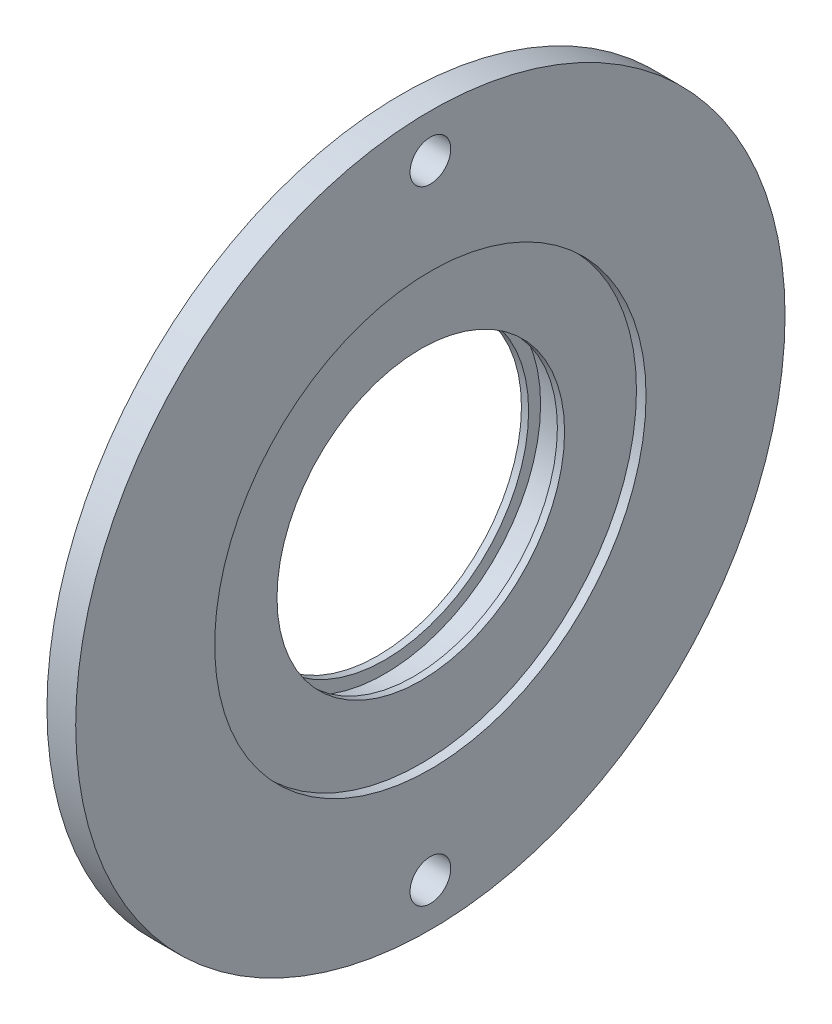
ISO-10303-21;
HEADER;
FILE_DESCRIPTION(('STEP AP214'),'2;1');
FILE_NAME('part.step','',(''),(''),'','','');
FILE_SCHEMA(('AUTOMOTIVE_DESIGN { 1 0 10303 214 1 1 1 1 }'));
ENDSEC;
DATA;
#1=APPLICATION_CONTEXT('core data for automotive mechanical design processes');
#2=APPLICATION_PROTOCOL_DEFINITION('international standard','automotive_design',2000,#1);
#3=PRODUCT_CONTEXT('',#1,'mechanical');
#4=PRODUCT('Part','Part','',(#3));
#5=PRODUCT_RELATED_PRODUCT_CATEGORY('part','',(#4));
#6=PRODUCT_DEFINITION_FORMATION('','',#4);
#7=PRODUCT_DEFINITION_CONTEXT('part definition',#1,'design');
#8=PRODUCT_DEFINITION('design','',#6,#7);
#9=PRODUCT_DEFINITION_SHAPE('','',#8);
#10=(LENGTH_UNIT() NAMED_UNIT(*) SI_UNIT(.MILLI.,.METRE.));
#11=(NAMED_UNIT(*) PLANE_ANGLE_UNIT() SI_UNIT($,.RADIAN.));
#12=(NAMED_UNIT(*) SI_UNIT($,.STERADIAN.) SOLID_ANGLE_UNIT());
#13=UNCERTAINTY_MEASURE_WITH_UNIT(LENGTH_MEASURE(1.E-05),#10,'distance_accuracy_value','');
#14=(GEOMETRIC_REPRESENTATION_CONTEXT(3) GLOBAL_UNCERTAINTY_ASSIGNED_CONTEXT((#13)) GLOBAL_UNIT_ASSIGNED_CONTEXT((#10,
#11,#12)) REPRESENTATION_CONTEXT('',''));
#15=CARTESIAN_POINT('',(0.,0.,0.));
#16=DIRECTION('',(0.,0.,1.));
#17=DIRECTION('',(1.,0.,0.));
#18=AXIS2_PLACEMENT_3D('',#15,#16,#17);
#19=CARTESIAN_POINT('',(22.,148.,0.));
#20=DIRECTION('',(1.,0.,0.));
#21=DIRECTION('',(0.,0.,-1.));
#22=AXIS2_PLACEMENT_3D('',#19,#20,#21);
#23=PLANE('',#22);
#24=CARTESIAN_POINT('',(22.,0.,0.));
#25=DIRECTION('',(1.,0.,0.));
#26=DIRECTION('',(0.,0.,-1.));
#27=AXIS2_PLACEMENT_3D('',#24,#25,#26);
#28=CIRCLE('',#27,90.);
#29=CARTESIAN_POINT('',(22.,0.,-90.));
#30=VERTEX_POINT('',#29);
#31=EDGE_CURVE('E76',#30,#30,#28,.T.);
#32=ORIENTED_EDGE('',*,*,#31,.F.);
#33=EDGE_LOOP('',(#32));
#34=FACE_BOUND('',#33,.T.);
#35=CARTESIAN_POINT('',(22.,-130.,0.));
#36=DIRECTION('',(1.,0.,0.));
#37=DIRECTION('',(0.,0.,-1.));
#38=AXIS2_PLACEMENT_3D('',#35,#36,#37);
#39=CIRCLE('',#38,8.5);
#40=CARTESIAN_POINT('',(22.,-130.,-8.5));
#41=VERTEX_POINT('',#40);
#42=EDGE_CURVE('E58',#41,#41,#39,.F.);
#43=ORIENTED_EDGE('',*,*,#42,.T.);
#44=EDGE_LOOP('',(#43));
#45=FACE_BOUND('',#44,.T.);
#46=CARTESIAN_POINT('',(22.,0.,0.));
#47=DIRECTION('',(1.,0.,0.));
#48=DIRECTION('',(0.,0.,-1.));
#49=AXIS2_PLACEMENT_3D('',#46,#47,#48);
#50=CIRCLE('',#49,148.);
#51=CARTESIAN_POINT('',(22.,0.,-148.));
#52=VERTEX_POINT('',#51);
#53=EDGE_CURVE('E69',#52,#52,#50,.T.);
#54=ORIENTED_EDGE('',*,*,#53,.T.);
#55=EDGE_LOOP('',(#54));
#56=FACE_BOUND('',#55,.T.);
#57=CARTESIAN_POINT('',(22.,130.,0.));
#58=DIRECTION('',(1.,0.,0.));
#59=DIRECTION('',(0.,0.,-1.));
#60=AXIS2_PLACEMENT_3D('',#57,#58,#59);
#61=CIRCLE('',#60,8.5);
#62=CARTESIAN_POINT('',(22.,130.,-8.5));
#63=VERTEX_POINT('',#62);
#64=EDGE_CURVE('E63',#63,#63,#61,.T.);
#65=ORIENTED_EDGE('',*,*,#64,.F.);
#66=EDGE_LOOP('',(#65));
#67=FACE_BOUND('',#66,.T.);
#68=ADVANCED_FACE('F37',(#34,#45,#56,#67),#23,.T.);
#69=CARTESIAN_POINT('',(10.,100.,0.));
#70=DIRECTION('',(-1.,0.,0.));
#71=DIRECTION('',(0.,0.,1.));
#72=AXIS2_PLACEMENT_3D('',#69,#70,#71);
#73=PLANE('',#72);
#74=CARTESIAN_POINT('',(10.,-130.,0.));
#75=DIRECTION('',(-1.,0.,0.));
#76=DIRECTION('',(0.,0.,1.));
#77=AXIS2_PLACEMENT_3D('',#74,#75,#76);
#78=CIRCLE('',#77,8.5);
#79=CARTESIAN_POINT('',(10.,-130.,8.5));
#80=VERTEX_POINT('',#79);
#81=EDGE_CURVE('E55',#80,#80,#78,.F.);
#82=ORIENTED_EDGE('',*,*,#81,.T.);
#83=EDGE_LOOP('',(#82));
#84=FACE_BOUND('',#83,.T.);
#85=CARTESIAN_POINT('',(10.,0.,0.));
#86=DIRECTION('',(1.,0.,0.));
#87=DIRECTION('',(0.,0.,-1.));
#88=AXIS2_PLACEMENT_3D('',#85,#86,#87);
#89=CIRCLE('',#88,100.);
#90=CARTESIAN_POINT('',(10.,0.,-100.));
#91=VERTEX_POINT('',#90);
#92=EDGE_CURVE('E45',#91,#91,#89,.T.);
#93=ORIENTED_EDGE('',*,*,#92,.T.);
#94=EDGE_LOOP('',(#93));
#95=FACE_BOUND('',#94,.T.);
#96=CARTESIAN_POINT('',(10.,0.,0.));
#97=DIRECTION('',(1.,0.,0.));
#98=DIRECTION('',(0.,0.,-1.));
#99=AXIS2_PLACEMENT_3D('',#96,#97,#98);
#100=CIRCLE('',#99,148.);
#101=CARTESIAN_POINT('',(10.,0.,-148.));
#102=VERTEX_POINT('',#101);
#103=EDGE_CURVE('E51',#102,#102,#100,.T.);
#104=ORIENTED_EDGE('',*,*,#103,.F.);
#105=EDGE_LOOP('',(#104));
#106=FACE_BOUND('',#105,.T.);
#107=CARTESIAN_POINT('',(10.,130.,0.));
#108=DIRECTION('',(-1.,0.,0.));
#109=DIRECTION('',(0.,0.,1.));
#110=AXIS2_PLACEMENT_3D('',#107,#108,#109);
#111=CIRCLE('',#110,8.5);
#112=CARTESIAN_POINT('',(10.,130.,8.5));
#113=VERTEX_POINT('',#112);
#114=EDGE_CURVE('E60',#113,#113,#111,.T.);
#115=ORIENTED_EDGE('',*,*,#114,.F.);
#116=EDGE_LOOP('',(#115));
#117=FACE_BOUND('',#116,.T.);
#118=ADVANCED_FACE('F88',(#84,#95,#106,#117),#73,.T.);
#119=CARTESIAN_POINT('',(0.,0.,0.));
#120=DIRECTION('',(-1.,0.,0.));
#121=DIRECTION('',(0.,0.,1.));
#122=AXIS2_PLACEMENT_3D('',#119,#120,#121);
#123=PLANE('',#122);
#124=CARTESIAN_POINT('',(0.,0.,0.));
#125=DIRECTION('',(1.,0.,0.));
#126=DIRECTION('',(0.,0.,-1.));
#127=AXIS2_PLACEMENT_3D('',#124,#125,#126);
#128=CIRCLE('',#127,60.);
#129=CARTESIAN_POINT('',(0.,0.,-60.));
#130=VERTEX_POINT('',#129);
#131=EDGE_CURVE('E158',#130,#130,#128,.T.);
#132=ORIENTED_EDGE('',*,*,#131,.T.);
#133=EDGE_LOOP('',(#132));
#134=FACE_BOUND('',#133,.T.);
#135=CARTESIAN_POINT('',(0.,0.,0.));
#136=DIRECTION('',(1.,0.,0.));
#137=DIRECTION('',(0.,0.,-1.));
#138=AXIS2_PLACEMENT_3D('',#135,#136,#137);
#139=CIRCLE('',#138,100.);
#140=CARTESIAN_POINT('',(0.,0.,-100.));
#141=VERTEX_POINT('',#140);
#142=EDGE_CURVE('E10',#141,#141,#139,.T.);
#143=ORIENTED_EDGE('',*,*,#142,.F.);
#144=EDGE_LOOP('',(#143));
#145=FACE_BOUND('',#144,.T.);
#146=ADVANCED_FACE('F91',(#134,#145),#123,.T.);
#147=CARTESIAN_POINT('',(22.,0.,0.));
#148=DIRECTION('',(1.,0.,0.));
#149=DIRECTION('',(0.,0.,-1.));
#150=AXIS2_PLACEMENT_3D('',#147,#148,#149);
#151=CYLINDRICAL_SURFACE('',#150,100.);
#152=ORIENTED_EDGE('',*,*,#142,.T.);
#153=EDGE_LOOP('',(#152));
#154=FACE_BOUND('',#153,.T.);
#155=ORIENTED_EDGE('',*,*,#92,.F.);
#156=EDGE_LOOP('',(#155));
#157=FACE_BOUND('',#156,.T.);
#158=ADVANCED_FACE('F98',(#154,#157),#151,.T.);
#159=CARTESIAN_POINT('',(22.,0.,0.));
#160=DIRECTION('',(1.,0.,0.));
#161=DIRECTION('',(0.,0.,-1.));
#162=AXIS2_PLACEMENT_3D('',#159,#160,#161);
#163=CYLINDRICAL_SURFACE('',#162,148.);
#164=ORIENTED_EDGE('',*,*,#103,.T.);
#165=EDGE_LOOP('',(#164));
#166=FACE_BOUND('',#165,.T.);
#167=ORIENTED_EDGE('',*,*,#53,.F.);
#168=EDGE_LOOP('',(#167));
#169=FACE_BOUND('',#168,.T.);
#170=ADVANCED_FACE('F85',(#166,#169),#163,.T.);
#171=CARTESIAN_POINT('',(0.,-130.,0.));
#172=DIRECTION('',(1.,0.,0.));
#173=DIRECTION('',(0.,0.,-1.));
#174=AXIS2_PLACEMENT_3D('',#171,#172,#173);
#175=CYLINDRICAL_SURFACE('',#174,8.5);
#176=ORIENTED_EDGE('',*,*,#42,.F.);
#177=EDGE_LOOP('',(#176));
#178=FACE_BOUND('',#177,.T.);
#179=ORIENTED_EDGE('',*,*,#81,.F.);
#180=EDGE_LOOP('',(#179));
#181=FACE_BOUND('',#180,.T.);
#182=ADVANCED_FACE('F109',(#178,#181),#175,.F.);
#183=CARTESIAN_POINT('',(0.,130.,0.));
#184=DIRECTION('',(1.,0.,0.));
#185=DIRECTION('',(0.,0.,-1.));
#186=AXIS2_PLACEMENT_3D('',#183,#184,#185);
#187=CYLINDRICAL_SURFACE('',#186,8.5);
#188=ORIENTED_EDGE('',*,*,#64,.T.);
#189=EDGE_LOOP('',(#188));
#190=FACE_BOUND('',#189,.T.);
#191=ORIENTED_EDGE('',*,*,#114,.T.);
#192=EDGE_LOOP('',(#191));
#193=FACE_BOUND('',#192,.T.);
#194=ADVANCED_FACE('F115',(#190,#193),#187,.F.);
#195=CARTESIAN_POINT('',(18.,0.,0.));
#196=DIRECTION('',(1.,0.,0.));
#197=DIRECTION('',(0.,0.,-1.));
#198=AXIS2_PLACEMENT_3D('',#195,#196,#197);
#199=CYLINDRICAL_SURFACE('',#198,90.);
#200=CARTESIAN_POINT('',(18.,0.,0.));
#201=DIRECTION('',(1.,0.,0.));
#202=DIRECTION('',(0.,0.,-1.));
#203=AXIS2_PLACEMENT_3D('',#200,#201,#202);
#204=CIRCLE('',#203,90.);
#205=CARTESIAN_POINT('',(18.,0.,-90.));
#206=VERTEX_POINT('',#205);
#207=EDGE_CURVE('E59',#206,#206,#204,.T.);
#208=ORIENTED_EDGE('',*,*,#207,.F.);
#209=EDGE_LOOP('',(#208));
#210=FACE_BOUND('',#209,.T.);
#211=ORIENTED_EDGE('',*,*,#31,.T.);
#212=EDGE_LOOP('',(#211));
#213=FACE_BOUND('',#212,.T.);
#214=ADVANCED_FACE('F120',(#210,#213),#199,.F.);
#215=CARTESIAN_POINT('',(18.,0.,0.));
#216=DIRECTION('',(1.,0.,0.));
#217=DIRECTION('',(0.,0.,-1.));
#218=AXIS2_PLACEMENT_3D('',#215,#216,#217);
#219=PLANE('',#218);
#220=CARTESIAN_POINT('',(18.,0.,0.));
#221=DIRECTION('',(1.,0.,0.));
#222=DIRECTION('',(0.,0.,-1.));
#223=AXIS2_PLACEMENT_3D('',#220,#221,#222);
#224=CIRCLE('',#223,60.);
#225=CARTESIAN_POINT('',(18.,0.,-60.));
#226=VERTEX_POINT('',#225);
#227=EDGE_CURVE('E166',#226,#226,#224,.T.);
#228=ORIENTED_EDGE('',*,*,#227,.F.);
#229=EDGE_LOOP('',(#228));
#230=FACE_BOUND('',#229,.T.);
#231=ORIENTED_EDGE('',*,*,#207,.T.);
#232=EDGE_LOOP('',(#231));
#233=FACE_BOUND('',#232,.T.);
#234=ADVANCED_FACE('F127',(#230,#233),#219,.T.);
#235=CARTESIAN_POINT('',(0.,0.,0.));
#236=DIRECTION('',(1.,0.,0.));
#237=DIRECTION('',(0.,0.,-1.));
#238=AXIS2_PLACEMENT_3D('',#235,#236,#237);
#239=CYLINDRICAL_SURFACE('',#238,60.);
#240=ORIENTED_EDGE('',*,*,#227,.T.);
#241=EDGE_LOOP('',(#240));
#242=FACE_BOUND('',#241,.T.);
#243=CARTESIAN_POINT('',(15.,0.,0.));
#244=DIRECTION('',(1.,0.,0.));
#245=DIRECTION('',(0.,0.,-1.));
#246=AXIS2_PLACEMENT_3D('',#243,#244,#245);
#247=CIRCLE('',#246,60.);
#248=CARTESIAN_POINT('',(15.,0.,-60.));
#249=VERTEX_POINT('',#248);
#250=EDGE_CURVE('E40',#249,#249,#247,.T.);
#251=ORIENTED_EDGE('',*,*,#250,.F.);
#252=EDGE_LOOP('',(#251));
#253=FACE_BOUND('',#252,.T.);
#254=ADVANCED_FACE('F131',(#242,#253),#239,.F.);
#255=CARTESIAN_POINT('',(2.99999999999999,0.,0.));
#256=DIRECTION('',(1.,0.,0.));
#257=DIRECTION('',(0.,0.,-1.));
#258=AXIS2_PLACEMENT_3D('',#255,#256,#257);
#259=CIRCLE('',#258,60.);
#260=CARTESIAN_POINT('',(2.99999999999999,0.,-60.));
#261=VERTEX_POINT('',#260);
#262=EDGE_CURVE('E155',#261,#261,#259,.T.);
#263=ORIENTED_EDGE('',*,*,#262,.T.);
#264=EDGE_LOOP('',(#263));
#265=FACE_BOUND('',#264,.T.);
#266=ORIENTED_EDGE('',*,*,#131,.F.);
#267=EDGE_LOOP('',(#266));
#268=FACE_BOUND('',#267,.T.);
#269=ADVANCED_FACE('F137',(#265,#268),#239,.F.);
#270=CARTESIAN_POINT('',(2.99999999999999,0.,0.));
#271=DIRECTION('',(1.,0.,0.));
#272=DIRECTION('',(0.,0.,-1.));
#273=AXIS2_PLACEMENT_3D('',#270,#271,#272);
#274=CYLINDRICAL_SURFACE('',#273,65.);
#275=CARTESIAN_POINT('',(2.99999999999999,0.,0.));
#276=DIRECTION('',(1.,0.,0.));
#277=DIRECTION('',(0.,0.,-1.));
#278=AXIS2_PLACEMENT_3D('',#275,#276,#277);
#279=CIRCLE('',#278,65.);
#280=CARTESIAN_POINT('',(2.99999999999999,0.,-65.));
#281=VERTEX_POINT('',#280);
#282=EDGE_CURVE('E171',#281,#281,#279,.T.);
#283=ORIENTED_EDGE('',*,*,#282,.F.);
#284=EDGE_LOOP('',(#283));
#285=FACE_BOUND('',#284,.T.);
#286=CARTESIAN_POINT('',(15.,0.,0.));
#287=DIRECTION('',(1.,0.,0.));
#288=DIRECTION('',(0.,0.,-1.));
#289=AXIS2_PLACEMENT_3D('',#286,#287,#288);
#290=CIRCLE('',#289,65.);
#291=CARTESIAN_POINT('',(15.,0.,-65.));
#292=VERTEX_POINT('',#291);
#293=EDGE_CURVE('E170',#292,#292,#290,.T.);
#294=ORIENTED_EDGE('',*,*,#293,.T.);
#295=EDGE_LOOP('',(#294));
#296=FACE_BOUND('',#295,.T.);
#297=ADVANCED_FACE('F133',(#285,#296),#274,.F.);
#298=CARTESIAN_POINT('',(2.99999999999999,0.,0.));
#299=DIRECTION('',(1.,0.,0.));
#300=DIRECTION('',(0.,0.,-1.));
#301=AXIS2_PLACEMENT_3D('',#298,#299,#300);
#302=PLANE('',#301);
#303=ORIENTED_EDGE('',*,*,#262,.F.);
#304=EDGE_LOOP('',(#303));
#305=FACE_BOUND('',#304,.T.);
#306=ORIENTED_EDGE('',*,*,#282,.T.);
#307=EDGE_LOOP('',(#306));
#308=FACE_BOUND('',#307,.T.);
#309=ADVANCED_FACE('F136',(#305,#308),#302,.T.);
#310=CARTESIAN_POINT('',(15.,0.,0.));
#311=DIRECTION('',(1.,0.,0.));
#312=DIRECTION('',(0.,0.,-1.));
#313=AXIS2_PLACEMENT_3D('',#310,#311,#312);
#314=PLANE('',#313);
#315=ORIENTED_EDGE('',*,*,#250,.T.);
#316=EDGE_LOOP('',(#315));
#317=FACE_BOUND('',#316,.T.);
#318=ORIENTED_EDGE('',*,*,#293,.F.);
#319=EDGE_LOOP('',(#318));
#320=FACE_BOUND('',#319,.T.);
#321=ADVANCED_FACE('F139',(#317,#320),#314,.F.);
#322=CLOSED_SHELL('',(#68,#118,#146,#158,#170,#182,#194,#214,#234,#254,#269,#297,#309,#321));
#323=MANIFOLD_SOLID_BREP('B2',#322);
#324=ADVANCED_BREP_SHAPE_REPRESENTATION('',(#18,#323),#14);
#325=SHAPE_DEFINITION_REPRESENTATION(#9,#324);
ENDSEC;
END-ISO-10303-21;
